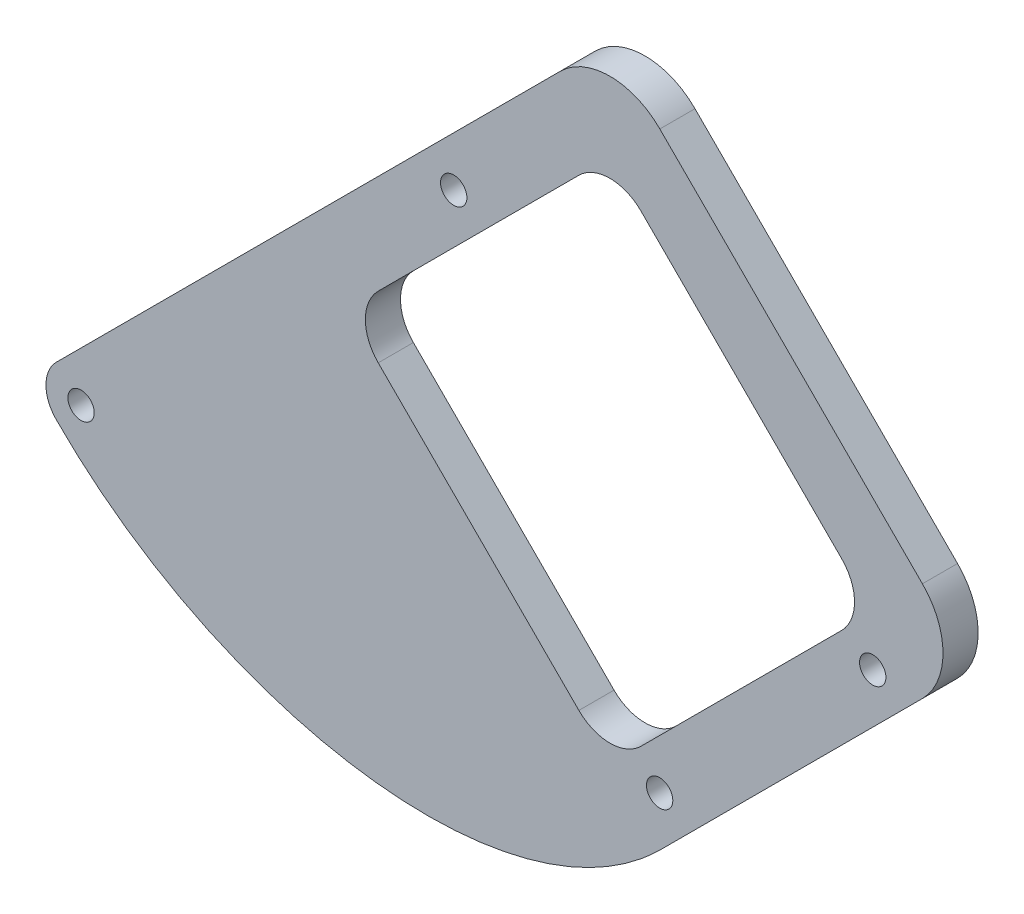
ISO-10303-21;
HEADER;
FILE_DESCRIPTION(('STEP AP214'),'2;1');
FILE_NAME('part.step','',(''),(''),'','','');
FILE_SCHEMA(('AUTOMOTIVE_DESIGN { 1 0 10303 214 1 1 1 1 }'));
ENDSEC;
DATA;
#1=APPLICATION_CONTEXT('core data for automotive mechanical design processes');
#2=APPLICATION_PROTOCOL_DEFINITION('international standard','automotive_design',2000,#1);
#3=PRODUCT_CONTEXT('',#1,'mechanical');
#4=PRODUCT('Part','Part','',(#3));
#5=PRODUCT_RELATED_PRODUCT_CATEGORY('part','',(#4));
#6=PRODUCT_DEFINITION_FORMATION('','',#4);
#7=PRODUCT_DEFINITION_CONTEXT('part definition',#1,'design');
#8=PRODUCT_DEFINITION('design','',#6,#7);
#9=PRODUCT_DEFINITION_SHAPE('','',#8);
#10=(LENGTH_UNIT() NAMED_UNIT(*) SI_UNIT(.MILLI.,.METRE.));
#11=(NAMED_UNIT(*) PLANE_ANGLE_UNIT() SI_UNIT($,.RADIAN.));
#12=(NAMED_UNIT(*) SI_UNIT($,.STERADIAN.) SOLID_ANGLE_UNIT());
#13=UNCERTAINTY_MEASURE_WITH_UNIT(LENGTH_MEASURE(1.E-05),#10,'distance_accuracy_value','');
#14=(GEOMETRIC_REPRESENTATION_CONTEXT(3) GLOBAL_UNCERTAINTY_ASSIGNED_CONTEXT((#13)) GLOBAL_UNIT_ASSIGNED_CONTEXT((#10,
#11,#12)) REPRESENTATION_CONTEXT('',''));
#15=CARTESIAN_POINT('',(0.,0.,0.));
#16=DIRECTION('',(0.,0.,1.));
#17=DIRECTION('',(1.,0.,0.));
#18=AXIS2_PLACEMENT_3D('',#15,#16,#17);
#19=CARTESIAN_POINT('',(0.,29.9184429747658,4.));
#20=DIRECTION('',(0.,0.,-1.));
#21=DIRECTION('',(-1.,0.,0.));
#22=AXIS2_PLACEMENT_3D('',#19,#20,#21);
#23=PLANE('',#22);
#24=CARTESIAN_POINT('',(5.65723178087394,-29.9180654433843,4.));
#25=DIRECTION('',(0.,0.,1.));
#26=DIRECTION('',(1.,0.,0.));
#27=AXIS2_PLACEMENT_3D('',#24,#25,#26);
#28=CIRCLE('',#27,1.5);
#29=CARTESIAN_POINT('',(7.15723178087394,-29.9180654433843,4.));
#30=VERTEX_POINT('',#29);
#31=EDGE_CURVE('E380',#30,#30,#28,.T.);
#32=ORIENTED_EDGE('',*,*,#31,.F.);
#33=EDGE_LOOP('',(#32));
#34=FACE_BOUND('',#33,.T.);
#35=DIRECTION('',(-0.707106781186547,-0.707106781186548,0.));
#36=VECTOR('',#35,1.);
#37=CARTESIAN_POINT('',(-20.6160757368753,20.6160757368753,4.));
#38=LINE('',#37,#36);
#39=CARTESIAN_POINT('',(-5.63352397406933,35.5986274996812,4.));
#40=VERTEX_POINT('',#39);
#41=CARTESIAN_POINT('',(-63.0424826080681,-21.8103311343176,4.));
#42=VERTEX_POINT('',#41);
#43=EDGE_CURVE('E147',#40,#42,#38,.T.);
#44=ORIENTED_EDGE('',*,*,#43,.T.);
#45=CARTESIAN_POINT('',(-60.2140554833219,-24.6387582590638,4.));
#46=DIRECTION('',(0.,0.,1.));
#47=DIRECTION('',(1.,0.,0.));
#48=AXIS2_PLACEMENT_3D('',#45,#46,#47);
#49=CIRCLE('',#48,4.00000000000003);
#50=CARTESIAN_POINT('',(-63.0424826080681,-27.46718538381,4.));
#51=VERTEX_POINT('',#50);
#52=EDGE_CURVE('E150',#42,#51,#49,.T.);
#53=ORIENTED_EDGE('',*,*,#52,.T.);
#54=CARTESIAN_POINT('',(-63.0424826080681,-27.46718538381,4.));
#55=CARTESIAN_POINT('',(-44.4751499786547,-46.2850309695617,4.));
#56=CARTESIAN_POINT('',(-11.3896069202171,-52.3167701264217,4.));
#57=CARTESIAN_POINT('',(5.65685424949251,-35.5752972242582,4.));
#58=B_SPLINE_CURVE_WITH_KNOTS('',3,(#54,#55,#56,#57),.UNSPECIFIED.,.F.,.F.,(4,4),(0.,1.),.UNSPECIFIED.);
#59=CARTESIAN_POINT('',(5.65685424949251,-35.5752972242582,4.));
#60=VERTEX_POINT('',#59);
#61=EDGE_CURVE('E174',#51,#60,#58,.T.);
#62=ORIENTED_EDGE('',*,*,#61,.T.);
#63=DIRECTION('',(0.707106781186547,0.707106781186548,0.));
#64=VECTOR('',#63,1.);
#65=CARTESIAN_POINT('',(8.48565890562013,-32.7464925681305,4.));
#66=LINE('',#65,#64);
#67=CARTESIAN_POINT('',(35.5752972242582,-5.65685424949247,4.));
#68=VERTEX_POINT('',#67);
#69=EDGE_CURVE('E177',#60,#68,#66,.T.);
#70=ORIENTED_EDGE('',*,*,#69,.T.);
#71=CARTESIAN_POINT('',(29.9184429747658,0.,4.));
#72=DIRECTION('',(0.,0.,1.));
#73=DIRECTION('',(-1.,0.,0.));
#74=AXIS2_PLACEMENT_3D('',#71,#72,#73);
#75=CIRCLE('',#74,8.00000000000001);
#76=CARTESIAN_POINT('',(35.5752972242582,5.65685424949229,4.));
#77=VERTEX_POINT('',#76);
#78=EDGE_CURVE('E602',#68,#77,#75,.T.);
#79=ORIENTED_EDGE('',*,*,#78,.T.);
#80=DIRECTION('',(-0.707106781186548,0.707106781186547,0.));
#81=VECTOR('',#80,1.);
#82=CARTESIAN_POINT('',(5.68018452492197,35.5519669488285,4.));
#83=LINE('',#82,#81);
#84=CARTESIAN_POINT('',(5.68018452492197,35.5519669488285,4.));
#85=VERTEX_POINT('',#84);
#86=EDGE_CURVE('E261',#77,#85,#83,.T.);
#87=ORIENTED_EDGE('',*,*,#86,.T.);
#88=CARTESIAN_POINT('',(0.,29.9184429747658,4.));
#89=DIRECTION('',(0.,0.,1.));
#90=DIRECTION('',(-1.,0.,0.));
#91=AXIS2_PLACEMENT_3D('',#88,#89,#90);
#92=CIRCLE('',#91,8.00006803742956);
#93=EDGE_CURVE('E153',#85,#40,#92,.T.);
#94=ORIENTED_EDGE('',*,*,#93,.T.);
#95=EDGE_LOOP('',(#44,#53,#62,#70,#79,#87,#94));
#96=FACE_BOUND('',#95,.T.);
#97=DIRECTION('',(0.707106781186548,-0.707106781186547,0.));
#98=VECTOR('',#97,1.);
#99=CARTESIAN_POINT('',(0.,-29.9184429747658,4.));
#100=LINE('',#99,#98);
#101=CARTESIAN_POINT('',(-26.3829090688331,-3.53553390593278,4.));
#102=VERTEX_POINT('',#101);
#103=CARTESIAN_POINT('',(-3.53553390593274,-26.3829090688331,4.));
#104=VERTEX_POINT('',#103);
#105=EDGE_CURVE('E351',#102,#104,#100,.T.);
#106=ORIENTED_EDGE('',*,*,#105,.F.);
#107=CARTESIAN_POINT('',(-22.8473751629003,0.,4.));
#108=DIRECTION('',(0.,0.,-1.));
#109=DIRECTION('',(-1.,0.,0.));
#110=AXIS2_PLACEMENT_3D('',#107,#108,#109);
#111=CIRCLE('',#110,5.);
#112=CARTESIAN_POINT('',(-26.3829090688331,3.53553390593271,4.));
#113=VERTEX_POINT('',#112);
#114=EDGE_CURVE('E11',#102,#113,#111,.T.);
#115=ORIENTED_EDGE('',*,*,#114,.T.);
#116=DIRECTION('',(-0.707106781186548,-0.707106781186547,0.));
#117=VECTOR('',#116,1.);
#118=CARTESIAN_POINT('',(-29.9184429747658,0.,4.));
#119=LINE('',#118,#117);
#120=CARTESIAN_POINT('',(-3.53553390593274,26.382909068833,4.));
#121=VERTEX_POINT('',#120);
#122=EDGE_CURVE('E349',#121,#113,#119,.T.);
#123=ORIENTED_EDGE('',*,*,#122,.F.);
#124=CARTESIAN_POINT('',(0.,22.8473751629003,4.));
#125=DIRECTION('',(0.,0.,-1.));
#126=DIRECTION('',(-1.,0.,0.));
#127=AXIS2_PLACEMENT_3D('',#124,#125,#126);
#128=CIRCLE('',#127,5.);
#129=CARTESIAN_POINT('',(3.53553390593272,26.382909068833,4.));
#130=VERTEX_POINT('',#129);
#131=EDGE_CURVE('E316',#121,#130,#128,.T.);
#132=ORIENTED_EDGE('',*,*,#131,.T.);
#133=DIRECTION('',(-0.707106781186547,0.707106781186548,0.));
#134=VECTOR('',#133,1.);
#135=CARTESIAN_POINT('',(29.9184429747658,0.,4.));
#136=LINE('',#135,#134);
#137=CARTESIAN_POINT('',(26.3829090688331,3.53553390593265,4.));
#138=VERTEX_POINT('',#137);
#139=EDGE_CURVE('E370',#138,#130,#136,.T.);
#140=ORIENTED_EDGE('',*,*,#139,.F.);
#141=CARTESIAN_POINT('',(22.8473751629003,0.,4.));
#142=DIRECTION('',(0.,0.,-1.));
#143=DIRECTION('',(-1.,0.,0.));
#144=AXIS2_PLACEMENT_3D('',#141,#142,#143);
#145=CIRCLE('',#144,5.);
#146=CARTESIAN_POINT('',(26.3829090688331,-3.53553390593283,4.));
#147=VERTEX_POINT('',#146);
#148=EDGE_CURVE('E322',#138,#147,#145,.T.);
#149=ORIENTED_EDGE('',*,*,#148,.T.);
#150=DIRECTION('',(0.707106781186549,0.707106781186546,0.));
#151=VECTOR('',#150,1.);
#152=CARTESIAN_POINT('',(29.9184429747658,0.,4.));
#153=LINE('',#152,#151);
#154=CARTESIAN_POINT('',(3.53553390593274,-26.3829090688331,4.));
#155=VERTEX_POINT('',#154);
#156=EDGE_CURVE('E359',#155,#147,#153,.T.);
#157=ORIENTED_EDGE('',*,*,#156,.F.);
#158=CARTESIAN_POINT('',(0.,-22.8473751629003,4.));
#159=DIRECTION('',(0.,0.,-1.));
#160=DIRECTION('',(-1.,0.,0.));
#161=AXIS2_PLACEMENT_3D('',#158,#159,#160);
#162=CIRCLE('',#161,5.);
#163=EDGE_CURVE('E55',#155,#104,#162,.T.);
#164=ORIENTED_EDGE('',*,*,#163,.T.);
#165=EDGE_LOOP('',(#106,#115,#123,#132,#140,#149,#157,#164));
#166=FACE_BOUND('',#165,.T.);
#167=CARTESIAN_POINT('',(29.9180654433844,-5.65723178087392,4.));
#168=DIRECTION('',(0.,0.,1.));
#169=DIRECTION('',(1.,0.,0.));
#170=AXIS2_PLACEMENT_3D('',#167,#168,#169);
#171=CIRCLE('',#170,1.50000000000001);
#172=CARTESIAN_POINT('',(31.4180654433844,-5.65723178087392,4.));
#173=VERTEX_POINT('',#172);
#174=EDGE_CURVE('E343',#173,#173,#171,.T.);
#175=ORIENTED_EDGE('',*,*,#174,.F.);
#176=EDGE_LOOP('',(#175));
#177=FACE_BOUND('',#176,.T.);
#178=CARTESIAN_POINT('',(-17.7876486121291,17.7876486121291,4.));
#179=DIRECTION('',(0.,0.,1.));
#180=DIRECTION('',(1.,0.,0.));
#181=AXIS2_PLACEMENT_3D('',#178,#179,#180);
#182=CIRCLE('',#181,1.5);
#183=CARTESIAN_POINT('',(-16.2876486121291,17.7876486121291,4.));
#184=VERTEX_POINT('',#183);
#185=EDGE_CURVE('E431',#184,#184,#182,.T.);
#186=ORIENTED_EDGE('',*,*,#185,.F.);
#187=EDGE_LOOP('',(#186));
#188=FACE_BOUND('',#187,.T.);
#189=CARTESIAN_POINT('',(-60.2140554833219,-24.6387582590638,4.));
#190=DIRECTION('',(0.,0.,1.));
#191=DIRECTION('',(1.,0.,0.));
#192=AXIS2_PLACEMENT_3D('',#189,#190,#191);
#193=CIRCLE('',#192,1.50000000000002);
#194=CARTESIAN_POINT('',(-58.7140554833219,-24.6387582590638,4.));
#195=VERTEX_POINT('',#194);
#196=EDGE_CURVE('E420',#195,#195,#193,.T.);
#197=ORIENTED_EDGE('',*,*,#196,.F.);
#198=EDGE_LOOP('',(#197));
#199=FACE_BOUND('',#198,.T.);
#200=ADVANCED_FACE('F39',(#34,#96,#166,#177,#188,#199),#23,.F.);
#201=CARTESIAN_POINT('',(0.,29.9184429747658,0.));
#202=DIRECTION('',(0.,0.,-1.));
#203=DIRECTION('',(-1.,0.,0.));
#204=AXIS2_PLACEMENT_3D('',#201,#202,#203);
#205=PLANE('',#204);
#206=CARTESIAN_POINT('',(-17.7876486121291,17.7876486121291,0.));
#207=DIRECTION('',(0.,0.,1.));
#208=DIRECTION('',(1.,0.,0.));
#209=AXIS2_PLACEMENT_3D('',#206,#207,#208);
#210=CIRCLE('',#209,1.5);
#211=CARTESIAN_POINT('',(-16.2876486121291,17.7876486121291,0.));
#212=VERTEX_POINT('',#211);
#213=EDGE_CURVE('E428',#212,#212,#210,.T.);
#214=ORIENTED_EDGE('',*,*,#213,.T.);
#215=EDGE_LOOP('',(#214));
#216=FACE_BOUND('',#215,.T.);
#217=DIRECTION('',(-0.707106781186547,0.707106781186548,0.));
#218=VECTOR('',#217,1.);
#219=CARTESIAN_POINT('',(29.9184429747658,0.,0.));
#220=LINE('',#219,#218);
#221=CARTESIAN_POINT('',(26.3829090688331,3.53553390593265,0.));
#222=VERTEX_POINT('',#221);
#223=CARTESIAN_POINT('',(3.53553390593272,26.382909068833,0.));
#224=VERTEX_POINT('',#223);
#225=EDGE_CURVE('E361',#222,#224,#220,.T.);
#226=ORIENTED_EDGE('',*,*,#225,.T.);
#227=CARTESIAN_POINT('',(0.,22.8473751629003,0.));
#228=DIRECTION('',(0.,0.,-1.));
#229=DIRECTION('',(-1.,0.,0.));
#230=AXIS2_PLACEMENT_3D('',#227,#228,#229);
#231=CIRCLE('',#230,5.);
#232=CARTESIAN_POINT('',(-3.53553390593276,26.382909068833,0.));
#233=VERTEX_POINT('',#232);
#234=EDGE_CURVE('E313',#224,#233,#231,.F.);
#235=ORIENTED_EDGE('',*,*,#234,.T.);
#236=DIRECTION('',(-0.707106781186547,-0.707106781186548,0.));
#237=VECTOR('',#236,1.);
#238=CARTESIAN_POINT('',(0.,29.9184429747657,0.));
#239=LINE('',#238,#237);
#240=CARTESIAN_POINT('',(-26.3829090688331,3.5355339059327,0.));
#241=VERTEX_POINT('',#240);
#242=EDGE_CURVE('E337',#233,#241,#239,.T.);
#243=ORIENTED_EDGE('',*,*,#242,.T.);
#244=CARTESIAN_POINT('',(-22.8473751629003,0.,0.));
#245=DIRECTION('',(0.,0.,-1.));
#246=DIRECTION('',(-1.,0.,0.));
#247=AXIS2_PLACEMENT_3D('',#244,#245,#246);
#248=CIRCLE('',#247,5.);
#249=CARTESIAN_POINT('',(-26.3829090688331,-3.53553390593278,0.));
#250=VERTEX_POINT('',#249);
#251=EDGE_CURVE('E48',#241,#250,#248,.F.);
#252=ORIENTED_EDGE('',*,*,#251,.T.);
#253=DIRECTION('',(0.707106781186548,-0.707106781186547,0.));
#254=VECTOR('',#253,1.);
#255=CARTESIAN_POINT('',(0.,-29.9184429747658,0.));
#256=LINE('',#255,#254);
#257=CARTESIAN_POINT('',(-3.53553390593274,-26.3829090688331,0.));
#258=VERTEX_POINT('',#257);
#259=EDGE_CURVE('E335',#250,#258,#256,.T.);
#260=ORIENTED_EDGE('',*,*,#259,.T.);
#261=CARTESIAN_POINT('',(0.,-22.8473751629003,0.));
#262=DIRECTION('',(0.,0.,-1.));
#263=DIRECTION('',(-1.,0.,0.));
#264=AXIS2_PLACEMENT_3D('',#261,#262,#263);
#265=CIRCLE('',#264,5.);
#266=CARTESIAN_POINT('',(3.53553390593274,-26.3829090688331,0.));
#267=VERTEX_POINT('',#266);
#268=EDGE_CURVE('E325',#258,#267,#265,.F.);
#269=ORIENTED_EDGE('',*,*,#268,.T.);
#270=DIRECTION('',(0.707106781186549,0.707106781186546,0.));
#271=VECTOR('',#270,1.);
#272=CARTESIAN_POINT('',(29.9184429747658,0.,0.));
#273=LINE('',#272,#271);
#274=CARTESIAN_POINT('',(26.3829090688331,-3.53553390593283,0.));
#275=VERTEX_POINT('',#274);
#276=EDGE_CURVE('E342',#267,#275,#273,.T.);
#277=ORIENTED_EDGE('',*,*,#276,.T.);
#278=CARTESIAN_POINT('',(22.8473751629003,0.,0.));
#279=DIRECTION('',(0.,0.,-1.));
#280=DIRECTION('',(-1.,0.,0.));
#281=AXIS2_PLACEMENT_3D('',#278,#279,#280);
#282=CIRCLE('',#281,5.);
#283=EDGE_CURVE('E319',#275,#222,#282,.F.);
#284=ORIENTED_EDGE('',*,*,#283,.T.);
#285=EDGE_LOOP('',(#226,#235,#243,#252,#260,#269,#277,#284));
#286=FACE_BOUND('',#285,.T.);
#287=CARTESIAN_POINT('',(5.65723178087394,-29.9180654433843,0.));
#288=DIRECTION('',(0.,0.,1.));
#289=DIRECTION('',(1.,0.,0.));
#290=AXIS2_PLACEMENT_3D('',#287,#288,#289);
#291=CIRCLE('',#290,1.5);
#292=CARTESIAN_POINT('',(7.15723178087394,-29.9180654433843,0.));
#293=VERTEX_POINT('',#292);
#294=EDGE_CURVE('E373',#293,#293,#291,.T.);
#295=ORIENTED_EDGE('',*,*,#294,.T.);
#296=EDGE_LOOP('',(#295));
#297=FACE_BOUND('',#296,.T.);
#298=DIRECTION('',(-0.707106781186548,-0.707106781186547,0.));
#299=VECTOR('',#298,1.);
#300=CARTESIAN_POINT('',(-20.6160757368753,20.6160757368753,0.));
#301=LINE('',#300,#299);
#302=CARTESIAN_POINT('',(-5.63352397406933,35.5986274996812,0.));
#303=VERTEX_POINT('',#302);
#304=CARTESIAN_POINT('',(-63.0424826080681,-21.8103311343176,0.));
#305=VERTEX_POINT('',#304);
#306=EDGE_CURVE('E163',#303,#305,#301,.T.);
#307=ORIENTED_EDGE('',*,*,#306,.F.);
#308=CARTESIAN_POINT('',(0.,29.9184429747658,0.));
#309=DIRECTION('',(0.,0.,1.));
#310=DIRECTION('',(-1.,0.,0.));
#311=AXIS2_PLACEMENT_3D('',#308,#309,#310);
#312=CIRCLE('',#311,8.00006803742956);
#313=CARTESIAN_POINT('',(5.68018452492197,35.5519669488285,0.));
#314=VERTEX_POINT('',#313);
#315=EDGE_CURVE('E158',#314,#303,#312,.T.);
#316=ORIENTED_EDGE('',*,*,#315,.F.);
#317=DIRECTION('',(-0.707106781186548,0.707106781186547,0.));
#318=VECTOR('',#317,1.);
#319=CARTESIAN_POINT('',(5.68018452492197,35.5519669488285,0.));
#320=LINE('',#319,#318);
#321=CARTESIAN_POINT('',(35.5752972242582,5.65685424949229,0.));
#322=VERTEX_POINT('',#321);
#323=EDGE_CURVE('E256',#322,#314,#320,.T.);
#324=ORIENTED_EDGE('',*,*,#323,.F.);
#325=CARTESIAN_POINT('',(29.9184429747658,0.,0.));
#326=DIRECTION('',(0.,0.,1.));
#327=DIRECTION('',(-1.,0.,0.));
#328=AXIS2_PLACEMENT_3D('',#325,#326,#327);
#329=CIRCLE('',#328,8.00000000000001);
#330=CARTESIAN_POINT('',(35.5752972242582,-5.65685424949247,0.));
#331=VERTEX_POINT('',#330);
#332=EDGE_CURVE('E246',#331,#322,#329,.T.);
#333=ORIENTED_EDGE('',*,*,#332,.F.);
#334=DIRECTION('',(0.707106781186547,0.707106781186548,0.));
#335=VECTOR('',#334,1.);
#336=CARTESIAN_POINT('',(32.7464925681306,-8.48565890562011,0.));
#337=LINE('',#336,#335);
#338=CARTESIAN_POINT('',(5.65685424949251,-35.5752972242582,0.));
#339=VERTEX_POINT('',#338);
#340=EDGE_CURVE('E257',#339,#331,#337,.T.);
#341=ORIENTED_EDGE('',*,*,#340,.F.);
#342=CARTESIAN_POINT('',(-63.0424826080681,-27.46718538381,0.));
#343=CARTESIAN_POINT('',(-44.4751499786547,-46.2850309695617,0.));
#344=CARTESIAN_POINT('',(-11.3896069202171,-52.3167701264217,0.));
#345=CARTESIAN_POINT('',(5.65685424949251,-35.5752972242582,0.));
#346=B_SPLINE_CURVE_WITH_KNOTS('',3,(#342,#343,#344,#345),.UNSPECIFIED.,.F.,.F.,(4,4),(0.,1.),.UNSPECIFIED.);
#347=CARTESIAN_POINT('',(-63.0424826080681,-27.46718538381,0.));
#348=VERTEX_POINT('',#347);
#349=EDGE_CURVE('E588',#348,#339,#346,.T.);
#350=ORIENTED_EDGE('',*,*,#349,.F.);
#351=CARTESIAN_POINT('',(-60.2140554833219,-24.6387582590638,0.));
#352=DIRECTION('',(0.,0.,1.));
#353=DIRECTION('',(1.,0.,0.));
#354=AXIS2_PLACEMENT_3D('',#351,#352,#353);
#355=CIRCLE('',#354,4.00000000000003);
#356=EDGE_CURVE('E585',#305,#348,#355,.T.);
#357=ORIENTED_EDGE('',*,*,#356,.F.);
#358=EDGE_LOOP('',(#307,#316,#324,#333,#341,#350,#357));
#359=FACE_BOUND('',#358,.T.);
#360=CARTESIAN_POINT('',(29.9180654433844,-5.65723178087392,0.));
#361=DIRECTION('',(0.,0.,1.));
#362=DIRECTION('',(1.,0.,0.));
#363=AXIS2_PLACEMENT_3D('',#360,#361,#362);
#364=CIRCLE('',#363,1.50000000000001);
#365=CARTESIAN_POINT('',(31.4180654433844,-5.65723178087392,0.));
#366=VERTEX_POINT('',#365);
#367=EDGE_CURVE('E364',#366,#366,#364,.T.);
#368=ORIENTED_EDGE('',*,*,#367,.T.);
#369=EDGE_LOOP('',(#368));
#370=FACE_BOUND('',#369,.T.);
#371=CARTESIAN_POINT('',(-60.2140554833219,-24.6387582590638,0.));
#372=DIRECTION('',(0.,0.,1.));
#373=DIRECTION('',(1.,0.,0.));
#374=AXIS2_PLACEMENT_3D('',#371,#372,#373);
#375=CIRCLE('',#374,1.50000000000002);
#376=CARTESIAN_POINT('',(-58.7140554833219,-24.6387582590638,0.));
#377=VERTEX_POINT('',#376);
#378=EDGE_CURVE('E423',#377,#377,#375,.T.);
#379=ORIENTED_EDGE('',*,*,#378,.T.);
#380=EDGE_LOOP('',(#379));
#381=FACE_BOUND('',#380,.T.);
#382=ADVANCED_FACE('F200',(#216,#286,#297,#359,#370,#381),#205,.T.);
#383=CARTESIAN_POINT('',(-20.6160757368753,20.6160757368753,4.));
#384=DIRECTION('',(0.707106781186547,-0.707106781186548,0.));
#385=DIRECTION('',(0.707106781186548,0.707106781186547,0.));
#386=AXIS2_PLACEMENT_3D('',#383,#384,#385);
#387=PLANE('',#386);
#388=ORIENTED_EDGE('',*,*,#306,.T.);
#389=DIRECTION('',(0.,0.,-1.));
#390=VECTOR('',#389,1.);
#391=CARTESIAN_POINT('',(-63.0424826080681,-21.8103311343176,4.));
#392=LINE('',#391,#390);
#393=EDGE_CURVE('E161',#42,#305,#392,.T.);
#394=ORIENTED_EDGE('',*,*,#393,.F.);
#395=ORIENTED_EDGE('',*,*,#43,.F.);
#396=DIRECTION('',(0.,0.,-1.));
#397=VECTOR('',#396,1.);
#398=CARTESIAN_POINT('',(-5.63352397406933,35.5986274996812,4.));
#399=LINE('',#398,#397);
#400=EDGE_CURVE('E274',#40,#303,#399,.T.);
#401=ORIENTED_EDGE('',*,*,#400,.T.);
#402=EDGE_LOOP('',(#388,#394,#395,#401));
#403=FACE_BOUND('',#402,.T.);
#404=ADVANCED_FACE('F162',(#403),#387,.F.);
#405=CARTESIAN_POINT('',(-60.2140554833219,-24.6387582590638,4.));
#406=DIRECTION('',(0.,0.,-1.));
#407=DIRECTION('',(-1.,0.,0.));
#408=AXIS2_PLACEMENT_3D('',#405,#406,#407);
#409=CYLINDRICAL_SURFACE('',#408,4.00000000000003);
#410=ORIENTED_EDGE('',*,*,#356,.T.);
#411=DIRECTION('',(0.,0.,-1.));
#412=VECTOR('',#411,1.);
#413=CARTESIAN_POINT('',(-63.0424826080681,-27.46718538381,4.));
#414=LINE('',#413,#412);
#415=EDGE_CURVE('E168',#51,#348,#414,.T.);
#416=ORIENTED_EDGE('',*,*,#415,.F.);
#417=ORIENTED_EDGE('',*,*,#52,.F.);
#418=ORIENTED_EDGE('',*,*,#393,.T.);
#419=EDGE_LOOP('',(#410,#416,#417,#418));
#420=FACE_BOUND('',#419,.T.);
#421=ADVANCED_FACE('F170',(#420),#409,.T.);
#422=DIRECTION('',(0.,0.,-1.));
#423=VECTOR('',#422,1.);
#424=SURFACE_OF_LINEAR_EXTRUSION('',#58,#423);
#425=ORIENTED_EDGE('',*,*,#349,.T.);
#426=DIRECTION('',(0.,0.,-1.));
#427=VECTOR('',#426,1.);
#428=CARTESIAN_POINT('',(5.65685424949251,-35.5752972242582,4.));
#429=LINE('',#428,#427);
#430=EDGE_CURVE('E281',#60,#339,#429,.T.);
#431=ORIENTED_EDGE('',*,*,#430,.F.);
#432=ORIENTED_EDGE('',*,*,#61,.F.);
#433=ORIENTED_EDGE('',*,*,#415,.T.);
#434=EDGE_LOOP('',(#425,#431,#432,#433));
#435=FACE_BOUND('',#434,.T.);
#436=ADVANCED_FACE('F189',(#435),#424,.F.);
#437=CARTESIAN_POINT('',(32.7464925681306,-8.48565890562011,4.));
#438=DIRECTION('',(-0.707106781186548,0.707106781186547,0.));
#439=DIRECTION('',(-0.707106781186547,-0.707106781186548,0.));
#440=AXIS2_PLACEMENT_3D('',#437,#438,#439);
#441=PLANE('',#440);
#442=ORIENTED_EDGE('',*,*,#340,.T.);
#443=DIRECTION('',(0.,0.,-1.));
#444=VECTOR('',#443,1.);
#445=CARTESIAN_POINT('',(35.5752972242582,-5.65685424949247,4.));
#446=LINE('',#445,#444);
#447=EDGE_CURVE('E252',#68,#331,#446,.T.);
#448=ORIENTED_EDGE('',*,*,#447,.F.);
#449=ORIENTED_EDGE('',*,*,#69,.F.);
#450=ORIENTED_EDGE('',*,*,#430,.T.);
#451=EDGE_LOOP('',(#442,#448,#449,#450));
#452=FACE_BOUND('',#451,.T.);
#453=ADVANCED_FACE('F193',(#452),#441,.F.);
#454=CARTESIAN_POINT('',(29.9184429747658,0.,4.));
#455=DIRECTION('',(0.,0.,-1.));
#456=DIRECTION('',(-1.,0.,0.));
#457=AXIS2_PLACEMENT_3D('',#454,#455,#456);
#458=CYLINDRICAL_SURFACE('',#457,8.00000000000001);
#459=ORIENTED_EDGE('',*,*,#332,.T.);
#460=DIRECTION('',(0.,0.,-1.));
#461=VECTOR('',#460,1.);
#462=CARTESIAN_POINT('',(35.5752972242582,5.65685424949229,4.));
#463=LINE('',#462,#461);
#464=EDGE_CURVE('E249',#77,#322,#463,.T.);
#465=ORIENTED_EDGE('',*,*,#464,.F.);
#466=ORIENTED_EDGE('',*,*,#78,.F.);
#467=ORIENTED_EDGE('',*,*,#447,.T.);
#468=EDGE_LOOP('',(#459,#465,#466,#467));
#469=FACE_BOUND('',#468,.T.);
#470=ADVANCED_FACE('F235',(#469),#458,.T.);
#471=CARTESIAN_POINT('',(5.68018452492197,35.5519669488285,4.));
#472=DIRECTION('',(-0.707106781186547,-0.707106781186548,0.));
#473=DIRECTION('',(0.707106781186548,-0.707106781186547,0.));
#474=AXIS2_PLACEMENT_3D('',#471,#472,#473);
#475=PLANE('',#474);
#476=ORIENTED_EDGE('',*,*,#323,.T.);
#477=DIRECTION('',(0.,0.,-1.));
#478=VECTOR('',#477,1.);
#479=CARTESIAN_POINT('',(5.68018452492197,35.5519669488285,4.));
#480=LINE('',#479,#478);
#481=EDGE_CURVE('E263',#85,#314,#480,.T.);
#482=ORIENTED_EDGE('',*,*,#481,.F.);
#483=ORIENTED_EDGE('',*,*,#86,.F.);
#484=ORIENTED_EDGE('',*,*,#464,.T.);
#485=EDGE_LOOP('',(#476,#482,#483,#484));
#486=FACE_BOUND('',#485,.T.);
#487=ADVANCED_FACE('F232',(#486),#475,.F.);
#488=CARTESIAN_POINT('',(0.,29.9184429747658,4.));
#489=DIRECTION('',(0.,0.,-1.));
#490=DIRECTION('',(-1.,0.,0.));
#491=AXIS2_PLACEMENT_3D('',#488,#489,#490);
#492=CYLINDRICAL_SURFACE('',#491,8.00006803742956);
#493=ORIENTED_EDGE('',*,*,#315,.T.);
#494=ORIENTED_EDGE('',*,*,#400,.F.);
#495=ORIENTED_EDGE('',*,*,#93,.F.);
#496=ORIENTED_EDGE('',*,*,#481,.T.);
#497=EDGE_LOOP('',(#493,#494,#495,#496));
#498=FACE_BOUND('',#497,.T.);
#499=ADVANCED_FACE('F229',(#498),#492,.T.);
#500=CARTESIAN_POINT('',(5.65723178087394,-29.9180654433843,4.));
#501=DIRECTION('',(0.,0.,-1.));
#502=DIRECTION('',(-1.,0.,0.));
#503=AXIS2_PLACEMENT_3D('',#500,#501,#502);
#504=CYLINDRICAL_SURFACE('',#503,1.5);
#505=ORIENTED_EDGE('',*,*,#31,.T.);
#506=EDGE_LOOP('',(#505));
#507=FACE_BOUND('',#506,.T.);
#508=ORIENTED_EDGE('',*,*,#294,.F.);
#509=EDGE_LOOP('',(#508));
#510=FACE_BOUND('',#509,.T.);
#511=ADVANCED_FACE('F226',(#507,#510),#504,.F.);
#512=CARTESIAN_POINT('',(0.,-29.9184429747658,4.));
#513=DIRECTION('',(0.707106781186547,0.707106781186548,0.));
#514=DIRECTION('',(-0.707106781186548,0.707106781186547,0.));
#515=AXIS2_PLACEMENT_3D('',#512,#513,#514);
#516=PLANE('',#515);
#517=ORIENTED_EDGE('',*,*,#105,.T.);
#518=DIRECTION('',(0.,0.,-1.));
#519=VECTOR('',#518,1.);
#520=CARTESIAN_POINT('',(-3.53553390593274,-26.3829090688331,0.));
#521=LINE('',#520,#519);
#522=EDGE_CURVE('E309',#104,#258,#521,.T.);
#523=ORIENTED_EDGE('',*,*,#522,.T.);
#524=ORIENTED_EDGE('',*,*,#259,.F.);
#525=DIRECTION('',(0.,0.,-1.));
#526=VECTOR('',#525,1.);
#527=CARTESIAN_POINT('',(-26.3829090688331,-3.53553390593278,4.));
#528=LINE('',#527,#526);
#529=EDGE_CURVE('E62',#250,#102,#528,.F.);
#530=ORIENTED_EDGE('',*,*,#529,.T.);
#531=EDGE_LOOP('',(#517,#523,#524,#530));
#532=FACE_BOUND('',#531,.T.);
#533=ADVANCED_FACE('F339',(#532),#516,.T.);
#534=CARTESIAN_POINT('',(29.9184429747658,0.,4.));
#535=DIRECTION('',(-0.707106781186546,0.707106781186549,0.));
#536=DIRECTION('',(-0.707106781186549,-0.707106781186546,0.));
#537=AXIS2_PLACEMENT_3D('',#534,#535,#536);
#538=PLANE('',#537);
#539=ORIENTED_EDGE('',*,*,#156,.T.);
#540=DIRECTION('',(0.,0.,-1.));
#541=VECTOR('',#540,1.);
#542=CARTESIAN_POINT('',(26.3829090688331,-3.53553390593283,0.));
#543=LINE('',#542,#541);
#544=EDGE_CURVE('E303',#147,#275,#543,.T.);
#545=ORIENTED_EDGE('',*,*,#544,.T.);
#546=ORIENTED_EDGE('',*,*,#276,.F.);
#547=DIRECTION('',(0.,0.,-1.));
#548=VECTOR('',#547,1.);
#549=CARTESIAN_POINT('',(3.53553390593273,-26.3829090688331,4.));
#550=LINE('',#549,#548);
#551=EDGE_CURVE('E300',#267,#155,#550,.F.);
#552=ORIENTED_EDGE('',*,*,#551,.T.);
#553=EDGE_LOOP('',(#539,#545,#546,#552));
#554=FACE_BOUND('',#553,.T.);
#555=ADVANCED_FACE('F392',(#554),#538,.T.);
#556=CARTESIAN_POINT('',(29.9184429747658,0.,4.));
#557=DIRECTION('',(-0.707106781186548,-0.707106781186547,0.));
#558=DIRECTION('',(0.707106781186547,-0.707106781186548,0.));
#559=AXIS2_PLACEMENT_3D('',#556,#557,#558);
#560=PLANE('',#559);
#561=ORIENTED_EDGE('',*,*,#139,.T.);
#562=DIRECTION('',(0.,0.,-1.));
#563=VECTOR('',#562,1.);
#564=CARTESIAN_POINT('',(3.53553390593272,26.382909068833,0.));
#565=LINE('',#564,#563);
#566=EDGE_CURVE('E289',#130,#224,#565,.T.);
#567=ORIENTED_EDGE('',*,*,#566,.T.);
#568=ORIENTED_EDGE('',*,*,#225,.F.);
#569=DIRECTION('',(0.,0.,-1.));
#570=VECTOR('',#569,1.);
#571=CARTESIAN_POINT('',(26.3829090688331,3.53553390593265,4.));
#572=LINE('',#571,#570);
#573=EDGE_CURVE('E167',#222,#138,#572,.F.);
#574=ORIENTED_EDGE('',*,*,#573,.T.);
#575=EDGE_LOOP('',(#561,#567,#568,#574));
#576=FACE_BOUND('',#575,.T.);
#577=ADVANCED_FACE('F396',(#576),#560,.T.);
#578=CARTESIAN_POINT('',(0.,29.9184429747657,4.));
#579=DIRECTION('',(0.707106781186548,-0.707106781186547,0.));
#580=DIRECTION('',(0.707106781186547,0.707106781186548,0.));
#581=AXIS2_PLACEMENT_3D('',#578,#579,#580);
#582=PLANE('',#581);
#583=ORIENTED_EDGE('',*,*,#242,.F.);
#584=DIRECTION('',(0.,0.,-1.));
#585=VECTOR('',#584,1.);
#586=CARTESIAN_POINT('',(-3.53553390593276,26.382909068833,4.));
#587=LINE('',#586,#585);
#588=EDGE_CURVE('E297',#233,#121,#587,.F.);
#589=ORIENTED_EDGE('',*,*,#588,.T.);
#590=ORIENTED_EDGE('',*,*,#122,.T.);
#591=DIRECTION('',(0.,0.,-1.));
#592=VECTOR('',#591,1.);
#593=CARTESIAN_POINT('',(-26.3829090688331,3.53553390593269,0.));
#594=LINE('',#593,#592);
#595=EDGE_CURVE('E293',#113,#241,#594,.T.);
#596=ORIENTED_EDGE('',*,*,#595,.T.);
#597=EDGE_LOOP('',(#583,#589,#590,#596));
#598=FACE_BOUND('',#597,.T.);
#599=ADVANCED_FACE('F353',(#598),#582,.T.);
#600=CARTESIAN_POINT('',(29.9180654433844,-5.65723178087392,4.));
#601=DIRECTION('',(0.,0.,-1.));
#602=DIRECTION('',(-1.,0.,0.));
#603=AXIS2_PLACEMENT_3D('',#600,#601,#602);
#604=CYLINDRICAL_SURFACE('',#603,1.50000000000001);
#605=ORIENTED_EDGE('',*,*,#174,.T.);
#606=EDGE_LOOP('',(#605));
#607=FACE_BOUND('',#606,.T.);
#608=ORIENTED_EDGE('',*,*,#367,.F.);
#609=EDGE_LOOP('',(#608));
#610=FACE_BOUND('',#609,.T.);
#611=ADVANCED_FACE('F405',(#607,#610),#604,.F.);
#612=CARTESIAN_POINT('',(-17.7876486121291,17.7876486121291,4.));
#613=DIRECTION('',(0.,0.,-1.));
#614=DIRECTION('',(-1.,0.,0.));
#615=AXIS2_PLACEMENT_3D('',#612,#613,#614);
#616=CYLINDRICAL_SURFACE('',#615,1.5);
#617=ORIENTED_EDGE('',*,*,#185,.T.);
#618=EDGE_LOOP('',(#617));
#619=FACE_BOUND('',#618,.T.);
#620=ORIENTED_EDGE('',*,*,#213,.F.);
#621=EDGE_LOOP('',(#620));
#622=FACE_BOUND('',#621,.T.);
#623=ADVANCED_FACE('F408',(#619,#622),#616,.F.);
#624=CARTESIAN_POINT('',(-60.2140554833219,-24.6387582590638,4.));
#625=DIRECTION('',(0.,0.,-1.));
#626=DIRECTION('',(-1.,0.,0.));
#627=AXIS2_PLACEMENT_3D('',#624,#625,#626);
#628=CYLINDRICAL_SURFACE('',#627,1.50000000000002);
#629=ORIENTED_EDGE('',*,*,#196,.T.);
#630=EDGE_LOOP('',(#629));
#631=FACE_BOUND('',#630,.T.);
#632=ORIENTED_EDGE('',*,*,#378,.F.);
#633=EDGE_LOOP('',(#632));
#634=FACE_BOUND('',#633,.T.);
#635=ADVANCED_FACE('F205',(#631,#634),#628,.F.);
#636=CARTESIAN_POINT('',(0.,22.8473751629003,4.));
#637=DIRECTION('',(0.,0.,1.));
#638=DIRECTION('',(1.,0.,0.));
#639=AXIS2_PLACEMENT_3D('',#636,#637,#638);
#640=CYLINDRICAL_SURFACE('',#639,5.);
#641=ORIENTED_EDGE('',*,*,#131,.F.);
#642=ORIENTED_EDGE('',*,*,#588,.F.);
#643=ORIENTED_EDGE('',*,*,#234,.F.);
#644=ORIENTED_EDGE('',*,*,#566,.F.);
#645=EDGE_LOOP('',(#641,#642,#643,#644));
#646=FACE_BOUND('',#645,.T.);
#647=ADVANCED_FACE('F201',(#646),#640,.F.);
#648=CARTESIAN_POINT('',(22.8473751629003,0.,4.));
#649=DIRECTION('',(0.,0.,1.));
#650=DIRECTION('',(1.,0.,0.));
#651=AXIS2_PLACEMENT_3D('',#648,#649,#650);
#652=CYLINDRICAL_SURFACE('',#651,5.);
#653=ORIENTED_EDGE('',*,*,#148,.F.);
#654=ORIENTED_EDGE('',*,*,#573,.F.);
#655=ORIENTED_EDGE('',*,*,#283,.F.);
#656=ORIENTED_EDGE('',*,*,#544,.F.);
#657=EDGE_LOOP('',(#653,#654,#655,#656));
#658=FACE_BOUND('',#657,.T.);
#659=ADVANCED_FACE('F204',(#658),#652,.F.);
#660=CARTESIAN_POINT('',(0.,-22.8473751629003,4.));
#661=DIRECTION('',(0.,0.,1.));
#662=DIRECTION('',(1.,0.,0.));
#663=AXIS2_PLACEMENT_3D('',#660,#661,#662);
#664=CYLINDRICAL_SURFACE('',#663,5.);
#665=ORIENTED_EDGE('',*,*,#163,.F.);
#666=ORIENTED_EDGE('',*,*,#551,.F.);
#667=ORIENTED_EDGE('',*,*,#268,.F.);
#668=ORIENTED_EDGE('',*,*,#522,.F.);
#669=EDGE_LOOP('',(#665,#666,#667,#668));
#670=FACE_BOUND('',#669,.T.);
#671=ADVANCED_FACE('F208',(#670),#664,.F.);
#672=CARTESIAN_POINT('',(-22.8473751629003,0.,4.));
#673=DIRECTION('',(0.,0.,1.));
#674=DIRECTION('',(1.,0.,0.));
#675=AXIS2_PLACEMENT_3D('',#672,#673,#674);
#676=CYLINDRICAL_SURFACE('',#675,5.);
#677=ORIENTED_EDGE('',*,*,#114,.F.);
#678=ORIENTED_EDGE('',*,*,#529,.F.);
#679=ORIENTED_EDGE('',*,*,#251,.F.);
#680=ORIENTED_EDGE('',*,*,#595,.F.);
#681=EDGE_LOOP('',(#677,#678,#679,#680));
#682=FACE_BOUND('',#681,.T.);
#683=ADVANCED_FACE('F41',(#682),#676,.F.);
#684=CLOSED_SHELL('',(#200,#382,#404,#421,#436,#453,#470,#487,#499,#511,#533,#555,#577,#599,
#611,#623,#635,#647,#659,#671,#683));
#685=MANIFOLD_SOLID_BREP('B2',#684);
#686=ADVANCED_BREP_SHAPE_REPRESENTATION('',(#18,#685),#14);
#687=SHAPE_DEFINITION_REPRESENTATION(#9,#686);
ENDSEC;
END-ISO-10303-21;
